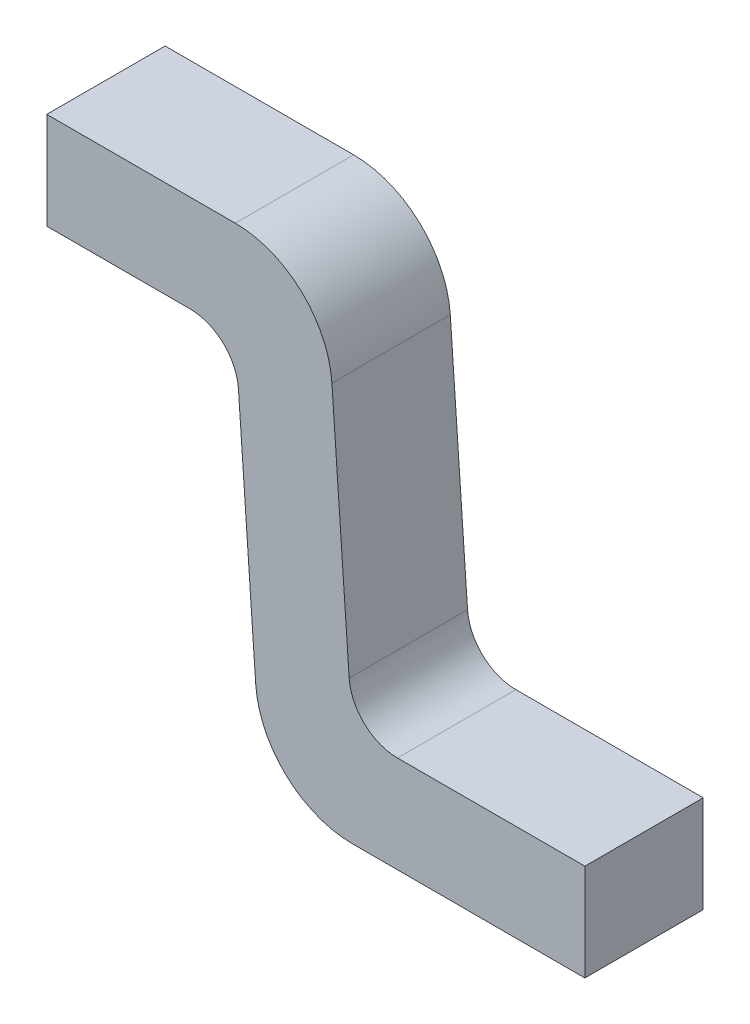
ISO-10303-21;
HEADER;
FILE_DESCRIPTION(('STEP AP214'),'2;1');
FILE_NAME('part.step','',(''),(''),'','','');
FILE_SCHEMA(('AUTOMOTIVE_DESIGN { 1 0 10303 214 1 1 1 1 }'));
ENDSEC;
DATA;
#1=APPLICATION_CONTEXT('core data for automotive mechanical design processes');
#2=APPLICATION_PROTOCOL_DEFINITION('international standard','automotive_design',2000,#1);
#3=PRODUCT_CONTEXT('',#1,'mechanical');
#4=PRODUCT('Part','Part','',(#3));
#5=PRODUCT_RELATED_PRODUCT_CATEGORY('part','',(#4));
#6=PRODUCT_DEFINITION_FORMATION('','',#4);
#7=PRODUCT_DEFINITION_CONTEXT('part definition',#1,'design');
#8=PRODUCT_DEFINITION('design','',#6,#7);
#9=PRODUCT_DEFINITION_SHAPE('','',#8);
#10=(LENGTH_UNIT() NAMED_UNIT(*) SI_UNIT(.MILLI.,.METRE.));
#11=(NAMED_UNIT(*) PLANE_ANGLE_UNIT() SI_UNIT($,.RADIAN.));
#12=(NAMED_UNIT(*) SI_UNIT($,.STERADIAN.) SOLID_ANGLE_UNIT());
#13=UNCERTAINTY_MEASURE_WITH_UNIT(LENGTH_MEASURE(1.E-05),#10,'distance_accuracy_value','');
#14=(GEOMETRIC_REPRESENTATION_CONTEXT(3) GLOBAL_UNCERTAINTY_ASSIGNED_CONTEXT((#13)) GLOBAL_UNIT_ASSIGNED_CONTEXT((#10,
#11,#12)) REPRESENTATION_CONTEXT('',''));
#15=CARTESIAN_POINT('',(0.,0.,0.));
#16=DIRECTION('',(0.,0.,1.));
#17=DIRECTION('',(1.,0.,0.));
#18=AXIS2_PLACEMENT_3D('',#15,#16,#17);
#19=CARTESIAN_POINT('',(0.651779073257,0.27,0.11));
#20=DIRECTION('',(0.,0.,-1.));
#21=DIRECTION('',(-1.,0.,0.));
#22=AXIS2_PLACEMENT_3D('',#19,#20,#21);
#23=PLANE('',#22);
#24=CARTESIAN_POINT('',(0.651779073257,0.27,0.11));
#25=DIRECTION('',(0.,0.,1.));
#26=DIRECTION('',(1.,0.,0.));
#27=AXIS2_PLACEMENT_3D('',#24,#25,#26);
#28=CIRCLE('',#27,0.09);
#29=CARTESIAN_POINT('',(0.651779073257,0.18,0.11));
#30=VERTEX_POINT('',#29);
#31=CARTESIAN_POINT('',(0.561998308733905,0.263721917363022,0.11));
#32=VERTEX_POINT('',#31);
#33=EDGE_CURVE('E20',#30,#32,#28,.F.);
#34=ORIENTED_EDGE('',*,*,#33,.T.);
#35=DIRECTION('',(-0.0697564737441078,0.997564050259825,0.));
#36=VECTOR('',#35,1.);
#37=CARTESIAN_POINT('',(0.529913492567,0.722556165274,0.11));
#38=LINE('',#37,#36);
#39=CARTESIAN_POINT('',(0.529913492567001,0.722556165273978,0.11));
#40=VERTEX_POINT('',#39);
#41=EDGE_CURVE('E184',#40,#32,#38,.F.);
#42=ORIENTED_EDGE('',*,*,#41,.F.);
#43=CARTESIAN_POINT('',(0.35035196352,0.71,0.11));
#44=DIRECTION('',(0.,0.,1.));
#45=DIRECTION('',(1.,0.,0.));
#46=AXIS2_PLACEMENT_3D('',#43,#44,#45);
#47=CIRCLE('',#46,0.18);
#48=CARTESIAN_POINT('',(0.35035196352,0.89,0.11));
#49=VERTEX_POINT('',#48);
#50=EDGE_CURVE('E215',#49,#40,#47,.F.);
#51=ORIENTED_EDGE('',*,*,#50,.F.);
#52=DIRECTION('',(1.,0.,0.));
#53=VECTOR('',#52,1.);
#54=CARTESIAN_POINT('',(0.,0.89,0.11));
#55=LINE('',#54,#53);
#56=CARTESIAN_POINT('',(0.,0.89,0.11));
#57=VERTEX_POINT('',#56);
#58=EDGE_CURVE('E122',#57,#49,#55,.T.);
#59=ORIENTED_EDGE('',*,*,#58,.F.);
#60=DIRECTION('',(0.,-1.,0.));
#61=VECTOR('',#60,1.);
#62=CARTESIAN_POINT('',(0.,0.89,0.11));
#63=LINE('',#62,#61);
#64=CARTESIAN_POINT('',(0.,0.71,0.11));
#65=VERTEX_POINT('',#64);
#66=EDGE_CURVE('E119',#65,#57,#63,.F.);
#67=ORIENTED_EDGE('',*,*,#66,.F.);
#68=DIRECTION('',(1.,0.,0.));
#69=VECTOR('',#68,1.);
#70=CARTESIAN_POINT('',(0.266425605768,0.71,0.11));
#71=LINE('',#70,#69);
#72=CARTESIAN_POINT('',(0.266425605768,0.71,0.11));
#73=VERTEX_POINT('',#72);
#74=EDGE_CURVE('E146',#73,#65,#71,.F.);
#75=ORIENTED_EDGE('',*,*,#74,.F.);
#76=CARTESIAN_POINT('',(0.266425605768,0.62,0.11));
#77=DIRECTION('',(0.,0.,1.));
#78=DIRECTION('',(1.,0.,0.));
#79=AXIS2_PLACEMENT_3D('',#76,#77,#78);
#80=CIRCLE('',#79,0.09);
#81=CARTESIAN_POINT('',(0.356206370291239,0.626278082636988,0.11));
#82=VERTEX_POINT('',#81);
#83=EDGE_CURVE('E152',#73,#82,#80,.F.);
#84=ORIENTED_EDGE('',*,*,#83,.T.);
#85=DIRECTION('',(0.0697564737441078,-0.997564050259825,0.));
#86=VECTOR('',#85,1.);
#87=CARTESIAN_POINT('',(0.388291186458,0.167443834726,0.11));
#88=LINE('',#87,#86);
#89=CARTESIAN_POINT('',(0.388291186457998,0.167443834726022,0.11));
#90=VERTEX_POINT('',#89);
#91=EDGE_CURVE('E155',#90,#82,#88,.F.);
#92=ORIENTED_EDGE('',*,*,#91,.F.);
#93=CARTESIAN_POINT('',(0.567852715505,0.18,0.11));
#94=DIRECTION('',(0.,0.,1.));
#95=DIRECTION('',(1.,0.,0.));
#96=AXIS2_PLACEMENT_3D('',#93,#94,#95);
#97=CIRCLE('',#96,0.18);
#98=CARTESIAN_POINT('',(0.567852715505,0.,0.11));
#99=VERTEX_POINT('',#98);
#100=EDGE_CURVE('E159',#99,#90,#97,.F.);
#101=ORIENTED_EDGE('',*,*,#100,.F.);
#102=DIRECTION('',(1.,0.,0.));
#103=VECTOR('',#102,1.);
#104=CARTESIAN_POINT('',(0.567852715505,0.,0.11));
#105=LINE('',#104,#103);
#106=CARTESIAN_POINT('',(1.,0.,0.11));
#107=VERTEX_POINT('',#106);
#108=EDGE_CURVE('E163',#107,#99,#105,.F.);
#109=ORIENTED_EDGE('',*,*,#108,.F.);
#110=DIRECTION('',(0.,1.,0.));
#111=VECTOR('',#110,1.);
#112=CARTESIAN_POINT('',(1.,0.,0.11));
#113=LINE('',#112,#111);
#114=CARTESIAN_POINT('',(1.,0.18,0.11));
#115=VERTEX_POINT('',#114);
#116=EDGE_CURVE('E167',#115,#107,#113,.F.);
#117=ORIENTED_EDGE('',*,*,#116,.F.);
#118=DIRECTION('',(-1.,0.,0.));
#119=VECTOR('',#118,1.);
#120=CARTESIAN_POINT('',(1.,0.18,0.11));
#121=LINE('',#120,#119);
#122=EDGE_CURVE('E93',#30,#115,#121,.F.);
#123=ORIENTED_EDGE('',*,*,#122,.F.);
#124=EDGE_LOOP('',(#34,#42,#51,#59,#67,#75,#84,#92,#101,#109,#117,#123));
#125=FACE_BOUND('',#124,.T.);
#126=ADVANCED_FACE('F17',(#125),#23,.F.);
#127=CARTESIAN_POINT('',(0.651779073257,0.27,-0.11));
#128=DIRECTION('',(0.,0.,1.));
#129=DIRECTION('',(1.,0.,0.));
#130=AXIS2_PLACEMENT_3D('',#127,#128,#129);
#131=CYLINDRICAL_SURFACE('',#130,0.09);
#132=DIRECTION('',(0.,0.,1.));
#133=VECTOR('',#132,1.);
#134=CARTESIAN_POINT('',(0.651779073257,0.18,-0.11));
#135=LINE('',#134,#133);
#136=CARTESIAN_POINT('',(0.651779073257,0.18,-0.11));
#137=VERTEX_POINT('',#136);
#138=EDGE_CURVE('E182',#137,#30,#135,.T.);
#139=ORIENTED_EDGE('',*,*,#138,.F.);
#140=CARTESIAN_POINT('',(0.651779073257,0.27,-0.11));
#141=DIRECTION('',(0.,0.,1.));
#142=DIRECTION('',(1.,0.,0.));
#143=AXIS2_PLACEMENT_3D('',#140,#141,#142);
#144=CIRCLE('',#143,0.09);
#145=CARTESIAN_POINT('',(0.561998308733952,0.263721917363016,-0.11));
#146=VERTEX_POINT('',#145);
#147=EDGE_CURVE('E187',#146,#137,#144,.T.);
#148=ORIENTED_EDGE('',*,*,#147,.F.);
#149=DIRECTION('',(0.,0.,1.));
#150=VECTOR('',#149,1.);
#151=CARTESIAN_POINT('',(0.561998308733907,0.263721917362994,-0.11));
#152=LINE('',#151,#150);
#153=EDGE_CURVE('E217',#32,#146,#152,.F.);
#154=ORIENTED_EDGE('',*,*,#153,.F.);
#155=ORIENTED_EDGE('',*,*,#33,.F.);
#156=EDGE_LOOP('',(#139,#148,#154,#155));
#157=FACE_BOUND('',#156,.T.);
#158=ADVANCED_FACE('F255',(#157),#131,.F.);
#159=CARTESIAN_POINT('',(1.,0.18,-0.11));
#160=DIRECTION('',(0.,1.,0.));
#161=DIRECTION('',(-1.,0.,0.));
#162=AXIS2_PLACEMENT_3D('',#159,#160,#161);
#163=PLANE('',#162);
#164=ORIENTED_EDGE('',*,*,#138,.T.);
#165=ORIENTED_EDGE('',*,*,#122,.T.);
#166=DIRECTION('',(0.,0.,1.));
#167=VECTOR('',#166,1.);
#168=CARTESIAN_POINT('',(1.,0.18,-0.11));
#169=LINE('',#168,#167);
#170=CARTESIAN_POINT('',(1.,0.18,-0.11));
#171=VERTEX_POINT('',#170);
#172=EDGE_CURVE('E177',#171,#115,#169,.T.);
#173=ORIENTED_EDGE('',*,*,#172,.F.);
#174=DIRECTION('',(-1.,0.,0.));
#175=VECTOR('',#174,1.);
#176=CARTESIAN_POINT('',(0.651779073257,0.18,-0.11));
#177=LINE('',#176,#175);
#178=EDGE_CURVE('E174',#137,#171,#177,.F.);
#179=ORIENTED_EDGE('',*,*,#178,.F.);
#180=EDGE_LOOP('',(#164,#165,#173,#179));
#181=FACE_BOUND('',#180,.T.);
#182=ADVANCED_FACE('F257',(#181),#163,.T.);
#183=CARTESIAN_POINT('',(1.,0.,-0.11));
#184=DIRECTION('',(1.,0.,0.));
#185=DIRECTION('',(0.,1.,0.));
#186=AXIS2_PLACEMENT_3D('',#183,#184,#185);
#187=PLANE('',#186);
#188=ORIENTED_EDGE('',*,*,#172,.T.);
#189=ORIENTED_EDGE('',*,*,#116,.T.);
#190=DIRECTION('',(0.,0.,1.));
#191=VECTOR('',#190,1.);
#192=CARTESIAN_POINT('',(1.,0.,-0.11));
#193=LINE('',#192,#191);
#194=CARTESIAN_POINT('',(1.,0.,-0.11));
#195=VERTEX_POINT('',#194);
#196=EDGE_CURVE('E164',#195,#107,#193,.T.);
#197=ORIENTED_EDGE('',*,*,#196,.F.);
#198=DIRECTION('',(0.,1.,0.));
#199=VECTOR('',#198,1.);
#200=CARTESIAN_POINT('',(1.,0.27,-0.11));
#201=LINE('',#200,#199);
#202=EDGE_CURVE('E170',#171,#195,#201,.F.);
#203=ORIENTED_EDGE('',*,*,#202,.F.);
#204=EDGE_LOOP('',(#188,#189,#197,#203));
#205=FACE_BOUND('',#204,.T.);
#206=ADVANCED_FACE('F259',(#205),#187,.T.);
#207=CARTESIAN_POINT('',(0.567852715505,0.,-0.11));
#208=DIRECTION('',(0.,-1.,0.));
#209=DIRECTION('',(1.,0.,0.));
#210=AXIS2_PLACEMENT_3D('',#207,#208,#209);
#211=PLANE('',#210);
#212=ORIENTED_EDGE('',*,*,#196,.T.);
#213=ORIENTED_EDGE('',*,*,#108,.T.);
#214=DIRECTION('',(0.,0.,1.));
#215=VECTOR('',#214,1.);
#216=CARTESIAN_POINT('',(0.567852715505,0.,-0.11));
#217=LINE('',#216,#215);
#218=CARTESIAN_POINT('',(0.567852715505,0.,-0.11));
#219=VERTEX_POINT('',#218);
#220=EDGE_CURVE('E160',#219,#99,#217,.T.);
#221=ORIENTED_EDGE('',*,*,#220,.F.);
#222=DIRECTION('',(-1.,0.,0.));
#223=VECTOR('',#222,1.);
#224=CARTESIAN_POINT('',(0.651779073257,0.,-0.11));
#225=LINE('',#224,#223);
#226=EDGE_CURVE('E173',#195,#219,#225,.T.);
#227=ORIENTED_EDGE('',*,*,#226,.F.);
#228=EDGE_LOOP('',(#212,#213,#221,#227));
#229=FACE_BOUND('',#228,.T.);
#230=ADVANCED_FACE('F260',(#229),#211,.T.);
#231=CARTESIAN_POINT('',(0.567852715505,0.18,-0.11));
#232=DIRECTION('',(0.,0.,1.));
#233=DIRECTION('',(1.,0.,0.));
#234=AXIS2_PLACEMENT_3D('',#231,#232,#233);
#235=CYLINDRICAL_SURFACE('',#234,0.18);
#236=ORIENTED_EDGE('',*,*,#220,.T.);
#237=ORIENTED_EDGE('',*,*,#100,.T.);
#238=DIRECTION('',(0.,0.,1.));
#239=VECTOR('',#238,1.);
#240=CARTESIAN_POINT('',(0.388291186458,0.167443834726,-0.11));
#241=LINE('',#240,#239);
#242=CARTESIAN_POINT('',(0.388291186458,0.167443834726004,-0.11));
#243=VERTEX_POINT('',#242);
#244=EDGE_CURVE('E156',#243,#90,#241,.T.);
#245=ORIENTED_EDGE('',*,*,#244,.F.);
#246=CARTESIAN_POINT('',(0.567852715505,0.18,-0.11));
#247=DIRECTION('',(0.,0.,1.));
#248=DIRECTION('',(1.,0.,0.));
#249=AXIS2_PLACEMENT_3D('',#246,#247,#248);
#250=CIRCLE('',#249,0.18);
#251=EDGE_CURVE('E210',#219,#243,#250,.F.);
#252=ORIENTED_EDGE('',*,*,#251,.F.);
#253=EDGE_LOOP('',(#236,#237,#245,#252));
#254=FACE_BOUND('',#253,.T.);
#255=ADVANCED_FACE('F222',(#254),#235,.T.);
#256=CARTESIAN_POINT('',(0.388291186458,0.167443834726,-0.11));
#257=DIRECTION('',(-0.997564050259826,-0.0697564737441078,0.));
#258=DIRECTION('',(0.0697564737441078,-0.997564050259825,0.));
#259=AXIS2_PLACEMENT_3D('',#256,#257,#258);
#260=PLANE('',#259);
#261=ORIENTED_EDGE('',*,*,#244,.T.);
#262=ORIENTED_EDGE('',*,*,#91,.T.);
#263=DIRECTION('',(0.,0.,1.));
#264=VECTOR('',#263,1.);
#265=CARTESIAN_POINT('',(0.35620637029138,0.626278082637027,-0.11));
#266=LINE('',#265,#264);
#267=CARTESIAN_POINT('',(0.356206370291192,0.626278082636994,-0.11));
#268=VERTEX_POINT('',#267);
#269=EDGE_CURVE('E153',#82,#268,#266,.F.);
#270=ORIENTED_EDGE('',*,*,#269,.T.);
#271=DIRECTION('',(-0.0697564737443103,0.997564050259811,0.));
#272=VECTOR('',#271,1.);
#273=CARTESIAN_POINT('',(0.388291186458,0.167443834726,-0.11));
#274=LINE('',#273,#272);
#275=EDGE_CURVE('E209',#243,#268,#274,.T.);
#276=ORIENTED_EDGE('',*,*,#275,.F.);
#277=EDGE_LOOP('',(#261,#262,#270,#276));
#278=FACE_BOUND('',#277,.T.);
#279=ADVANCED_FACE('F230',(#278),#260,.T.);
#280=CARTESIAN_POINT('',(0.266425605768,0.62,-0.11));
#281=DIRECTION('',(0.,0.,1.));
#282=DIRECTION('',(1.,0.,0.));
#283=AXIS2_PLACEMENT_3D('',#280,#281,#282);
#284=CYLINDRICAL_SURFACE('',#283,0.09);
#285=DIRECTION('',(0.,0.,1.));
#286=VECTOR('',#285,1.);
#287=CARTESIAN_POINT('',(0.266425605768,0.71,-0.11));
#288=LINE('',#287,#286);
#289=CARTESIAN_POINT('',(0.266425605768,0.71,-0.11));
#290=VERTEX_POINT('',#289);
#291=EDGE_CURVE('E149',#290,#73,#288,.T.);
#292=ORIENTED_EDGE('',*,*,#291,.F.);
#293=CARTESIAN_POINT('',(0.266425605768,0.62,-0.11));
#294=DIRECTION('',(0.,0.,1.));
#295=DIRECTION('',(1.,0.,0.));
#296=AXIS2_PLACEMENT_3D('',#293,#294,#295);
#297=CIRCLE('',#296,0.09);
#298=EDGE_CURVE('E137',#268,#290,#297,.T.);
#299=ORIENTED_EDGE('',*,*,#298,.F.);
#300=ORIENTED_EDGE('',*,*,#269,.F.);
#301=ORIENTED_EDGE('',*,*,#83,.F.);
#302=EDGE_LOOP('',(#292,#299,#300,#301));
#303=FACE_BOUND('',#302,.T.);
#304=ADVANCED_FACE('F286',(#303),#284,.F.);
#305=CARTESIAN_POINT('',(0.266425605768,0.71,-0.11));
#306=DIRECTION('',(0.,-1.,0.));
#307=DIRECTION('',(1.,0.,0.));
#308=AXIS2_PLACEMENT_3D('',#305,#306,#307);
#309=PLANE('',#308);
#310=ORIENTED_EDGE('',*,*,#291,.T.);
#311=ORIENTED_EDGE('',*,*,#74,.T.);
#312=DIRECTION('',(0.,0.,1.));
#313=VECTOR('',#312,1.);
#314=CARTESIAN_POINT('',(0.,0.71,-0.11));
#315=LINE('',#314,#313);
#316=CARTESIAN_POINT('',(0.,0.71,-0.11));
#317=VERTEX_POINT('',#316);
#318=EDGE_CURVE('E144',#317,#65,#315,.T.);
#319=ORIENTED_EDGE('',*,*,#318,.F.);
#320=DIRECTION('',(-1.,0.,0.));
#321=VECTOR('',#320,1.);
#322=CARTESIAN_POINT('',(0.651779073257,0.71,-0.11));
#323=LINE('',#322,#321);
#324=EDGE_CURVE('E135',#290,#317,#323,.T.);
#325=ORIENTED_EDGE('',*,*,#324,.F.);
#326=EDGE_LOOP('',(#310,#311,#319,#325));
#327=FACE_BOUND('',#326,.T.);
#328=ADVANCED_FACE('F283',(#327),#309,.T.);
#329=CARTESIAN_POINT('',(0.,0.89,-0.11));
#330=DIRECTION('',(-1.,0.,0.));
#331=DIRECTION('',(0.,-1.,0.));
#332=AXIS2_PLACEMENT_3D('',#329,#330,#331);
#333=PLANE('',#332);
#334=ORIENTED_EDGE('',*,*,#318,.T.);
#335=ORIENTED_EDGE('',*,*,#66,.T.);
#336=DIRECTION('',(0.,0.,1.));
#337=VECTOR('',#336,1.);
#338=CARTESIAN_POINT('',(0.,0.89,-0.11));
#339=LINE('',#338,#337);
#340=CARTESIAN_POINT('',(0.,0.89,-0.11));
#341=VERTEX_POINT('',#340);
#342=EDGE_CURVE('E111',#341,#57,#339,.T.);
#343=ORIENTED_EDGE('',*,*,#342,.F.);
#344=DIRECTION('',(0.,1.,0.));
#345=VECTOR('',#344,1.);
#346=CARTESIAN_POINT('',(0.,0.27,-0.11));
#347=LINE('',#346,#345);
#348=EDGE_CURVE('E116',#317,#341,#347,.T.);
#349=ORIENTED_EDGE('',*,*,#348,.F.);
#350=EDGE_LOOP('',(#334,#335,#343,#349));
#351=FACE_BOUND('',#350,.T.);
#352=ADVANCED_FACE('F114',(#351),#333,.T.);
#353=CARTESIAN_POINT('',(0.,0.89,-0.11));
#354=DIRECTION('',(0.,1.,0.));
#355=DIRECTION('',(0.,0.,1.));
#356=AXIS2_PLACEMENT_3D('',#353,#354,#355);
#357=PLANE('',#356);
#358=ORIENTED_EDGE('',*,*,#342,.T.);
#359=ORIENTED_EDGE('',*,*,#58,.T.);
#360=DIRECTION('',(0.,0.,1.));
#361=VECTOR('',#360,1.);
#362=CARTESIAN_POINT('',(0.35035196352,0.89,-0.11));
#363=LINE('',#362,#361);
#364=CARTESIAN_POINT('',(0.35035196352,0.89,-0.11));
#365=VERTEX_POINT('',#364);
#366=EDGE_CURVE('E128',#365,#49,#363,.T.);
#367=ORIENTED_EDGE('',*,*,#366,.F.);
#368=DIRECTION('',(-1.,0.,0.));
#369=VECTOR('',#368,1.);
#370=CARTESIAN_POINT('',(0.651779073257,0.89,-0.11));
#371=LINE('',#370,#369);
#372=EDGE_CURVE('E125',#341,#365,#371,.F.);
#373=ORIENTED_EDGE('',*,*,#372,.F.);
#374=EDGE_LOOP('',(#358,#359,#367,#373));
#375=FACE_BOUND('',#374,.T.);
#376=ADVANCED_FACE('F126',(#375),#357,.T.);
#377=CARTESIAN_POINT('',(0.35035196352,0.71,-0.11));
#378=DIRECTION('',(0.,0.,1.));
#379=DIRECTION('',(1.,0.,0.));
#380=AXIS2_PLACEMENT_3D('',#377,#378,#379);
#381=CYLINDRICAL_SURFACE('',#380,0.18);
#382=ORIENTED_EDGE('',*,*,#366,.T.);
#383=ORIENTED_EDGE('',*,*,#50,.T.);
#384=DIRECTION('',(0.,0.,1.));
#385=VECTOR('',#384,1.);
#386=CARTESIAN_POINT('',(0.529913492567,0.722556165274,-0.11));
#387=LINE('',#386,#385);
#388=CARTESIAN_POINT('',(0.529913492567,0.722556165273996,-0.11));
#389=VERTEX_POINT('',#388);
#390=EDGE_CURVE('E35',#389,#40,#387,.T.);
#391=ORIENTED_EDGE('',*,*,#390,.F.);
#392=CARTESIAN_POINT('',(0.35035196352,0.71,-0.11));
#393=DIRECTION('',(0.,0.,1.));
#394=DIRECTION('',(1.,0.,0.));
#395=AXIS2_PLACEMENT_3D('',#392,#393,#394);
#396=CIRCLE('',#395,0.18);
#397=EDGE_CURVE('E26',#365,#389,#396,.F.);
#398=ORIENTED_EDGE('',*,*,#397,.F.);
#399=EDGE_LOOP('',(#382,#383,#391,#398));
#400=FACE_BOUND('',#399,.T.);
#401=ADVANCED_FACE('F250',(#400),#381,.T.);
#402=CARTESIAN_POINT('',(0.529913492567,0.722556165274,-0.11));
#403=DIRECTION('',(0.997564050259826,0.0697564737441078,0.));
#404=DIRECTION('',(-0.0697564737441078,0.997564050259825,0.));
#405=AXIS2_PLACEMENT_3D('',#402,#403,#404);
#406=PLANE('',#405);
#407=ORIENTED_EDGE('',*,*,#390,.T.);
#408=ORIENTED_EDGE('',*,*,#41,.T.);
#409=ORIENTED_EDGE('',*,*,#153,.T.);
#410=DIRECTION('',(0.0697564737443103,-0.997564050259811,0.));
#411=VECTOR('',#410,1.);
#412=CARTESIAN_POINT('',(0.529913492567,0.722556165274,-0.11));
#413=LINE('',#412,#411);
#414=EDGE_CURVE('E11',#389,#146,#413,.T.);
#415=ORIENTED_EDGE('',*,*,#414,.F.);
#416=EDGE_LOOP('',(#407,#408,#409,#415));
#417=FACE_BOUND('',#416,.T.);
#418=ADVANCED_FACE('F254',(#417),#406,.T.);
#419=CARTESIAN_POINT('',(0.651779073257,0.27,-0.11));
#420=DIRECTION('',(0.,0.,-1.));
#421=DIRECTION('',(-1.,0.,0.));
#422=AXIS2_PLACEMENT_3D('',#419,#420,#421);
#423=PLANE('',#422);
#424=ORIENTED_EDGE('',*,*,#397,.T.);
#425=ORIENTED_EDGE('',*,*,#414,.T.);
#426=ORIENTED_EDGE('',*,*,#147,.T.);
#427=ORIENTED_EDGE('',*,*,#178,.T.);
#428=ORIENTED_EDGE('',*,*,#202,.T.);
#429=ORIENTED_EDGE('',*,*,#226,.T.);
#430=ORIENTED_EDGE('',*,*,#251,.T.);
#431=ORIENTED_EDGE('',*,*,#275,.T.);
#432=ORIENTED_EDGE('',*,*,#298,.T.);
#433=ORIENTED_EDGE('',*,*,#324,.T.);
#434=ORIENTED_EDGE('',*,*,#348,.T.);
#435=ORIENTED_EDGE('',*,*,#372,.T.);
#436=EDGE_LOOP('',(#424,#425,#426,#427,#428,#429,#430,#431,#432,#433,#434,#435));
#437=FACE_BOUND('',#436,.T.);
#438=ADVANCED_FACE('F132',(#437),#423,.T.);
#439=CLOSED_SHELL('',(#126,#158,#182,#206,#230,#255,#279,#304,#328,#352,#376,#401,#418,#438));
#440=MANIFOLD_SOLID_BREP('B1',#439);
#441=ADVANCED_BREP_SHAPE_REPRESENTATION('',(#18,#440),#14);
#442=SHAPE_DEFINITION_REPRESENTATION(#9,#441);
ENDSEC;
END-ISO-10303-21;
